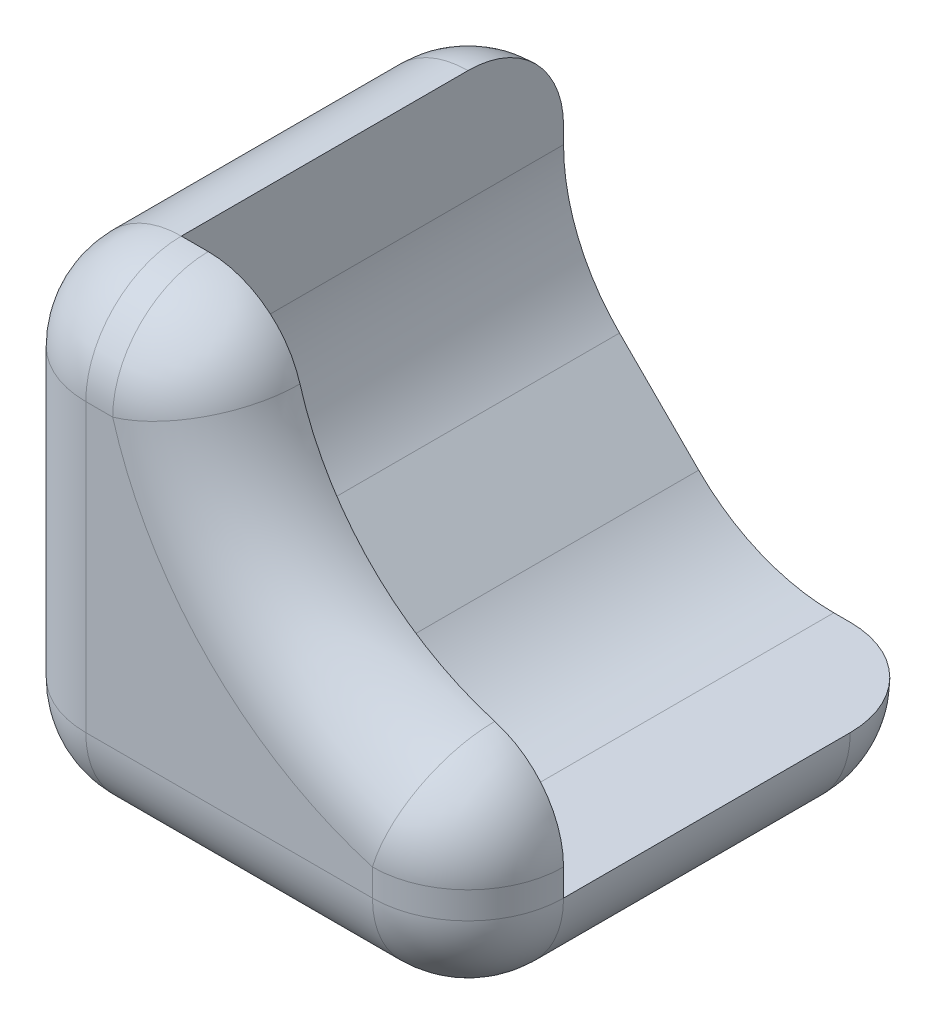
ISO-10303-21;
HEADER;
FILE_DESCRIPTION(('STEP AP214'),'2;1');
FILE_NAME('part.step','',(''),(''),'','','');
FILE_SCHEMA(('AUTOMOTIVE_DESIGN { 1 0 10303 214 1 1 1 1 }'));
ENDSEC;
DATA;
#1=APPLICATION_CONTEXT('core data for automotive mechanical design processes');
#2=APPLICATION_PROTOCOL_DEFINITION('international standard','automotive_design',2000,#1);
#3=PRODUCT_CONTEXT('',#1,'mechanical');
#4=PRODUCT('Part','Part','',(#3));
#5=PRODUCT_RELATED_PRODUCT_CATEGORY('part','',(#4));
#6=PRODUCT_DEFINITION_FORMATION('','',#4);
#7=PRODUCT_DEFINITION_CONTEXT('part definition',#1,'design');
#8=PRODUCT_DEFINITION('design','',#6,#7);
#9=PRODUCT_DEFINITION_SHAPE('','',#8);
#10=(LENGTH_UNIT() NAMED_UNIT(*) SI_UNIT(.MILLI.,.METRE.));
#11=(NAMED_UNIT(*) PLANE_ANGLE_UNIT() SI_UNIT($,.RADIAN.));
#12=(NAMED_UNIT(*) SI_UNIT($,.STERADIAN.) SOLID_ANGLE_UNIT());
#13=UNCERTAINTY_MEASURE_WITH_UNIT(LENGTH_MEASURE(1.E-05),#10,'distance_accuracy_value','');
#14=(GEOMETRIC_REPRESENTATION_CONTEXT(3) GLOBAL_UNCERTAINTY_ASSIGNED_CONTEXT((#13)) GLOBAL_UNIT_ASSIGNED_CONTEXT((#10,
#11,#12)) REPRESENTATION_CONTEXT('',''));
#15=CARTESIAN_POINT('',(0.,0.,0.));
#16=DIRECTION('',(0.,0.,1.));
#17=DIRECTION('',(1.,0.,0.));
#18=AXIS2_PLACEMENT_3D('',#15,#16,#17);
#19=CARTESIAN_POINT('',(0.,20.,-10.));
#20=DIRECTION('',(0.,0.,-1.));
#21=DIRECTION('',(-1.,0.,0.));
#22=AXIS2_PLACEMENT_3D('',#19,#20,#21);
#23=PLANE('',#22);
#24=CARTESIAN_POINT('',(7.07106781186547,15.,-10.));
#25=DIRECTION('',(0.,0.,-1.));
#26=DIRECTION('',(-1.,0.,0.));
#27=AXIS2_PLACEMENT_3D('',#24,#25,#26);
#28=CIRCLE('',#27,5.);
#29=CARTESIAN_POINT('',(7.0710678118655,10.,-10.));
#30=VERTEX_POINT('',#29);
#31=CARTESIAN_POINT('',(3.53553390593272,11.4644660940673,-10.));
#32=VERTEX_POINT('',#31);
#33=EDGE_CURVE('E172',#30,#32,#28,.T.);
#34=ORIENTED_EDGE('',*,*,#33,.F.);
#35=DIRECTION('',(1.,0.,0.));
#36=VECTOR('',#35,1.);
#37=CARTESIAN_POINT('',(0.,10.,-10.));
#38=LINE('',#37,#36);
#39=CARTESIAN_POINT('',(0.,10.,-10.));
#40=VERTEX_POINT('',#39);
#41=EDGE_CURVE('E236',#30,#40,#38,.F.);
#42=ORIENTED_EDGE('',*,*,#41,.T.);
#43=DIRECTION('',(0.,1.,0.));
#44=VECTOR('',#43,1.);
#45=CARTESIAN_POINT('',(0.,20.,-10.));
#46=LINE('',#45,#44);
#47=CARTESIAN_POINT('',(0.,17.0710678118655,-10.));
#48=VERTEX_POINT('',#47);
#49=EDGE_CURVE('E170',#40,#48,#46,.T.);
#50=ORIENTED_EDGE('',*,*,#49,.T.);
#51=CARTESIAN_POINT('',(5.,17.0710678118655,-10.));
#52=DIRECTION('',(0.,0.,-1.));
#53=DIRECTION('',(-1.,0.,0.));
#54=AXIS2_PLACEMENT_3D('',#51,#52,#53);
#55=CIRCLE('',#54,5.);
#56=CARTESIAN_POINT('',(1.46446609406728,13.5355339059327,-10.));
#57=VERTEX_POINT('',#56);
#58=EDGE_CURVE('E157',#57,#48,#55,.T.);
#59=ORIENTED_EDGE('',*,*,#58,.F.);
#60=DIRECTION('',(-0.707106781186548,0.707106781186547,0.));
#61=VECTOR('',#60,1.);
#62=CARTESIAN_POINT('',(7.5,7.5,-10.));
#63=LINE('',#62,#61);
#64=EDGE_CURVE('E168',#32,#57,#63,.T.);
#65=ORIENTED_EDGE('',*,*,#64,.F.);
#66=EDGE_LOOP('',(#34,#42,#50,#59,#65));
#67=FACE_BOUND('',#66,.T.);
#68=ADVANCED_FACE('F37',(#67),#23,.T.);
#69=CARTESIAN_POINT('',(0.,10.,0.));
#70=DIRECTION('',(0.,-1.,0.));
#71=DIRECTION('',(0.,0.,-1.));
#72=AXIS2_PLACEMENT_3D('',#69,#70,#71);
#73=PLANE('',#72);
#74=DIRECTION('',(0.,0.,-1.));
#75=VECTOR('',#74,1.);
#76=CARTESIAN_POINT('',(10.,10.,0.));
#77=LINE('',#76,#75);
#78=CARTESIAN_POINT('',(10.,10.,0.));
#79=VERTEX_POINT('',#78);
#80=CARTESIAN_POINT('',(10.,10.,-7.5));
#81=VERTEX_POINT('',#80);
#82=EDGE_CURVE('E202',#79,#81,#77,.T.);
#83=ORIENTED_EDGE('',*,*,#82,.T.);
#84=CARTESIAN_POINT('',(7.5,10.,-7.5));
#85=DIRECTION('',(0.,-1.,0.));
#86=DIRECTION('',(0.,0.,-1.));
#87=AXIS2_PLACEMENT_3D('',#84,#85,#86);
#88=CIRCLE('',#87,2.5);
#89=CARTESIAN_POINT('',(7.5,10.,-10.));
#90=VERTEX_POINT('',#89);
#91=EDGE_CURVE('E258',#81,#90,#88,.F.);
#92=ORIENTED_EDGE('',*,*,#91,.T.);
#93=DIRECTION('',(-1.,0.,0.));
#94=VECTOR('',#93,1.);
#95=CARTESIAN_POINT('',(0.,10.,-10.));
#96=LINE('',#95,#94);
#97=EDGE_CURVE('E206',#90,#30,#96,.T.);
#98=ORIENTED_EDGE('',*,*,#97,.T.);
#99=DIRECTION('',(0.,0.,1.));
#100=VECTOR('',#99,1.);
#101=CARTESIAN_POINT('',(7.0710678118655,10.,-10.));
#102=LINE('',#101,#100);
#103=CARTESIAN_POINT('',(7.0710678118655,10.,0.));
#104=VERTEX_POINT('',#103);
#105=EDGE_CURVE('E188',#30,#104,#102,.T.);
#106=ORIENTED_EDGE('',*,*,#105,.T.);
#107=DIRECTION('',(1.,0.,0.));
#108=VECTOR('',#107,1.);
#109=CARTESIAN_POINT('',(20.,10.,0.));
#110=LINE('',#109,#108);
#111=EDGE_CURVE('E191',#104,#79,#110,.T.);
#112=ORIENTED_EDGE('',*,*,#111,.T.);
#113=EDGE_LOOP('',(#83,#92,#98,#106,#112));
#114=FACE_BOUND('',#113,.T.);
#115=ADVANCED_FACE('F369',(#114),#73,.F.);
#116=CARTESIAN_POINT('',(0.,10.,-20.));
#117=DIRECTION('',(-1.,0.,0.));
#118=DIRECTION('',(0.,0.,1.));
#119=AXIS2_PLACEMENT_3D('',#116,#117,#118);
#120=PLANE('',#119);
#121=DIRECTION('',(0.,1.,0.));
#122=VECTOR('',#121,1.);
#123=CARTESIAN_POINT('',(0.,20.,-10.));
#124=LINE('',#123,#122);
#125=CARTESIAN_POINT('',(0.,17.5,-10.));
#126=VERTEX_POINT('',#125);
#127=EDGE_CURVE('E200',#48,#126,#124,.T.);
#128=ORIENTED_EDGE('',*,*,#127,.T.);
#129=CARTESIAN_POINT('',(0.,17.5,-7.5));
#130=DIRECTION('',(-1.,0.,0.));
#131=DIRECTION('',(0.,0.,1.));
#132=AXIS2_PLACEMENT_3D('',#129,#130,#131);
#133=CIRCLE('',#132,2.5);
#134=CARTESIAN_POINT('',(0.,20.,-7.5));
#135=VERTEX_POINT('',#134);
#136=EDGE_CURVE('E11',#126,#135,#133,.F.);
#137=ORIENTED_EDGE('',*,*,#136,.T.);
#138=DIRECTION('',(0.,0.,1.));
#139=VECTOR('',#138,1.);
#140=CARTESIAN_POINT('',(0.,20.,0.));
#141=LINE('',#140,#139);
#142=CARTESIAN_POINT('',(0.,20.,0.));
#143=VERTEX_POINT('',#142);
#144=EDGE_CURVE('E204',#135,#143,#141,.T.);
#145=ORIENTED_EDGE('',*,*,#144,.T.);
#146=DIRECTION('',(0.,1.,0.));
#147=VECTOR('',#146,1.);
#148=CARTESIAN_POINT('',(0.,10.,0.));
#149=LINE('',#148,#147);
#150=CARTESIAN_POINT('',(0.,17.0710678118655,0.));
#151=VERTEX_POINT('',#150);
#152=EDGE_CURVE('E194',#151,#143,#149,.T.);
#153=ORIENTED_EDGE('',*,*,#152,.F.);
#154=DIRECTION('',(0.,0.,1.));
#155=VECTOR('',#154,1.);
#156=CARTESIAN_POINT('',(0.,17.0710678118655,-10.));
#157=LINE('',#156,#155);
#158=EDGE_CURVE('E162',#48,#151,#157,.T.);
#159=ORIENTED_EDGE('',*,*,#158,.F.);
#160=EDGE_LOOP('',(#128,#137,#145,#153,#159));
#161=FACE_BOUND('',#160,.T.);
#162=ADVANCED_FACE('F306',(#161),#120,.F.);
#163=CARTESIAN_POINT('',(20.,10.,0.));
#164=DIRECTION('',(0.,0.,1.));
#165=DIRECTION('',(1.,0.,0.));
#166=AXIS2_PLACEMENT_3D('',#163,#164,#165);
#167=PLANE('',#166);
#168=DIRECTION('',(1.,0.,0.));
#169=VECTOR('',#168,1.);
#170=CARTESIAN_POINT('',(20.,20.,0.));
#171=LINE('',#170,#169);
#172=CARTESIAN_POINT('',(0.704264225231354,20.,0.));
#173=VERTEX_POINT('',#172);
#174=EDGE_CURVE('E190',#143,#173,#171,.T.);
#175=ORIENTED_EDGE('',*,*,#174,.T.);
#176=CARTESIAN_POINT('',(0.704264225231354,17.5,0.));
#177=DIRECTION('',(0.,0.,1.));
#178=DIRECTION('',(1.,0.,0.));
#179=AXIS2_PLACEMENT_3D('',#176,#177,#178);
#180=CIRCLE('',#179,2.5);
#181=CARTESIAN_POINT('',(3.10402338364829,18.2008252147248,0.));
#182=VERTEX_POINT('',#181);
#183=EDGE_CURVE('E266',#173,#182,#180,.F.);
#184=ORIENTED_EDGE('',*,*,#183,.T.);
#185=CARTESIAN_POINT('',(10.3033008588991,20.3033008588991,0.));
#186=DIRECTION('',(0.,0.,1.));
#187=DIRECTION('',(1.,0.,0.));
#188=AXIS2_PLACEMENT_3D('',#185,#186,#187);
#189=CIRCLE('',#188,7.5);
#190=CARTESIAN_POINT('',(8.20082521472478,13.1040233836483,0.));
#191=VERTEX_POINT('',#190);
#192=EDGE_CURVE('E183',#182,#191,#189,.T.);
#193=ORIENTED_EDGE('',*,*,#192,.T.);
#194=CARTESIAN_POINT('',(7.5,10.7042642252314,0.));
#195=DIRECTION('',(0.,0.,1.));
#196=DIRECTION('',(1.,0.,0.));
#197=AXIS2_PLACEMENT_3D('',#194,#195,#196);
#198=CIRCLE('',#197,2.5);
#199=CARTESIAN_POINT('',(10.,10.7042642252314,0.));
#200=VERTEX_POINT('',#199);
#201=EDGE_CURVE('E254',#191,#200,#198,.F.);
#202=ORIENTED_EDGE('',*,*,#201,.T.);
#203=DIRECTION('',(0.,-1.,0.));
#204=VECTOR('',#203,1.);
#205=CARTESIAN_POINT('',(10.,20.,0.));
#206=LINE('',#205,#204);
#207=EDGE_CURVE('E198',#200,#79,#206,.T.);
#208=ORIENTED_EDGE('',*,*,#207,.T.);
#209=ORIENTED_EDGE('',*,*,#111,.F.);
#210=CARTESIAN_POINT('',(7.07106781186547,15.,0.));
#211=DIRECTION('',(0.,0.,-1.));
#212=DIRECTION('',(-1.,0.,0.));
#213=AXIS2_PLACEMENT_3D('',#210,#211,#212);
#214=CIRCLE('',#213,5.);
#215=CARTESIAN_POINT('',(3.53553390593272,11.4644660940673,0.));
#216=VERTEX_POINT('',#215);
#217=EDGE_CURVE('E181',#104,#216,#214,.T.);
#218=ORIENTED_EDGE('',*,*,#217,.T.);
#219=DIRECTION('',(-0.707106781186548,0.707106781186547,0.));
#220=VECTOR('',#219,1.);
#221=CARTESIAN_POINT('',(7.5,7.5,0.));
#222=LINE('',#221,#220);
#223=CARTESIAN_POINT('',(1.46446609406728,13.5355339059327,0.));
#224=VERTEX_POINT('',#223);
#225=EDGE_CURVE('E185',#216,#224,#222,.T.);
#226=ORIENTED_EDGE('',*,*,#225,.T.);
#227=CARTESIAN_POINT('',(5.,17.0710678118655,0.));
#228=DIRECTION('',(0.,0.,-1.));
#229=DIRECTION('',(-1.,0.,0.));
#230=AXIS2_PLACEMENT_3D('',#227,#228,#229);
#231=CIRCLE('',#230,5.);
#232=EDGE_CURVE('E158',#224,#151,#231,.T.);
#233=ORIENTED_EDGE('',*,*,#232,.T.);
#234=ORIENTED_EDGE('',*,*,#152,.T.);
#235=EDGE_LOOP('',(#175,#184,#193,#202,#208,#209,#218,#226,#233,#234));
#236=FACE_BOUND('',#235,.T.);
#237=ADVANCED_FACE('F509',(#236),#167,.F.);
#238=CARTESIAN_POINT('',(7.07106781186547,15.,-10.));
#239=DIRECTION('',(0.,0.,1.));
#240=DIRECTION('',(1.,0.,0.));
#241=AXIS2_PLACEMENT_3D('',#238,#239,#240);
#242=CYLINDRICAL_SURFACE('',#241,5.);
#243=ORIENTED_EDGE('',*,*,#217,.F.);
#244=ORIENTED_EDGE('',*,*,#105,.F.);
#245=ORIENTED_EDGE('',*,*,#33,.T.);
#246=DIRECTION('',(0.,0.,1.));
#247=VECTOR('',#246,1.);
#248=CARTESIAN_POINT('',(3.53553390593272,11.4644660940673,-10.));
#249=LINE('',#248,#247);
#250=EDGE_CURVE('E163',#32,#216,#249,.T.);
#251=ORIENTED_EDGE('',*,*,#250,.T.);
#252=EDGE_LOOP('',(#243,#244,#245,#251));
#253=FACE_BOUND('',#252,.T.);
#254=ADVANCED_FACE('F516',(#253),#242,.F.);
#255=CARTESIAN_POINT('',(5.,17.0710678118655,-10.));
#256=DIRECTION('',(0.,0.,1.));
#257=DIRECTION('',(1.,0.,0.));
#258=AXIS2_PLACEMENT_3D('',#255,#256,#257);
#259=CYLINDRICAL_SURFACE('',#258,5.);
#260=ORIENTED_EDGE('',*,*,#232,.F.);
#261=DIRECTION('',(0.,0.,1.));
#262=VECTOR('',#261,1.);
#263=CARTESIAN_POINT('',(1.46446609406728,13.5355339059327,-10.));
#264=LINE('',#263,#262);
#265=EDGE_CURVE('E153',#57,#224,#264,.T.);
#266=ORIENTED_EDGE('',*,*,#265,.F.);
#267=ORIENTED_EDGE('',*,*,#58,.T.);
#268=ORIENTED_EDGE('',*,*,#158,.T.);
#269=EDGE_LOOP('',(#260,#266,#267,#268));
#270=FACE_BOUND('',#269,.T.);
#271=ADVANCED_FACE('F155',(#270),#259,.F.);
#272=CARTESIAN_POINT('',(7.5,7.5,-10.));
#273=DIRECTION('',(0.707106781186547,0.707106781186548,0.));
#274=DIRECTION('',(-0.707106781186548,0.707106781186547,0.));
#275=AXIS2_PLACEMENT_3D('',#272,#273,#274);
#276=PLANE('',#275);
#277=ORIENTED_EDGE('',*,*,#225,.F.);
#278=ORIENTED_EDGE('',*,*,#250,.F.);
#279=ORIENTED_EDGE('',*,*,#64,.T.);
#280=ORIENTED_EDGE('',*,*,#265,.T.);
#281=EDGE_LOOP('',(#277,#278,#279,#280));
#282=FACE_BOUND('',#281,.T.);
#283=ADVANCED_FACE('F174',(#282),#276,.T.);
#284=CARTESIAN_POINT('',(-2.5,0.,-19.));
#285=DIRECTION('',(-1.,0.,0.));
#286=DIRECTION('',(0.,-1.,0.));
#287=AXIS2_PLACEMENT_3D('',#284,#285,#286);
#288=PLANE('',#287);
#289=DIRECTION('',(0.,-1.,0.));
#290=VECTOR('',#289,1.);
#291=CARTESIAN_POINT('',(-2.49999999999999,20.,0.));
#292=LINE('',#291,#290);
#293=CARTESIAN_POINT('',(-2.5,10.,0.));
#294=VERTEX_POINT('',#293);
#295=CARTESIAN_POINT('',(-2.49999999999999,17.5,0.));
#296=VERTEX_POINT('',#295);
#297=EDGE_CURVE('E210',#294,#296,#292,.F.);
#298=ORIENTED_EDGE('',*,*,#297,.T.);
#299=DIRECTION('',(0.,0.,1.));
#300=VECTOR('',#299,1.);
#301=CARTESIAN_POINT('',(-2.49999999999999,17.5,-19.));
#302=LINE('',#301,#300);
#303=CARTESIAN_POINT('',(-2.49999999999999,17.5,-7.5));
#304=VERTEX_POINT('',#303);
#305=EDGE_CURVE('E61',#296,#304,#302,.F.);
#306=ORIENTED_EDGE('',*,*,#305,.T.);
#307=DIRECTION('',(0.,1.,0.));
#308=VECTOR('',#307,1.);
#309=CARTESIAN_POINT('',(-2.5,0.,-7.5));
#310=LINE('',#309,#308);
#311=CARTESIAN_POINT('',(-2.49999999999999,10.,-7.5));
#312=VERTEX_POINT('',#311);
#313=EDGE_CURVE('E238',#304,#312,#310,.F.);
#314=ORIENTED_EDGE('',*,*,#313,.T.);
#315=DIRECTION('',(0.,0.,1.));
#316=VECTOR('',#315,1.);
#317=CARTESIAN_POINT('',(-2.49999999999999,10.,0.));
#318=LINE('',#317,#316);
#319=EDGE_CURVE('E212',#312,#294,#318,.T.);
#320=ORIENTED_EDGE('',*,*,#319,.T.);
#321=EDGE_LOOP('',(#298,#306,#314,#320));
#322=FACE_BOUND('',#321,.T.);
#323=ADVANCED_FACE('F357',(#322),#288,.T.);
#324=CARTESIAN_POINT('',(0.,7.5,-19.));
#325=DIRECTION('',(0.,1.,0.));
#326=DIRECTION('',(0.,0.,1.));
#327=AXIS2_PLACEMENT_3D('',#324,#325,#326);
#328=PLANE('',#327);
#329=DIRECTION('',(1.,0.,0.));
#330=VECTOR('',#329,1.);
#331=CARTESIAN_POINT('',(10.,7.5,-7.5));
#332=LINE('',#331,#330);
#333=CARTESIAN_POINT('',(0.,7.5,-7.5));
#334=VERTEX_POINT('',#333);
#335=CARTESIAN_POINT('',(7.5,7.5,-7.5));
#336=VERTEX_POINT('',#335);
#337=EDGE_CURVE('E225',#334,#336,#332,.T.);
#338=ORIENTED_EDGE('',*,*,#337,.T.);
#339=DIRECTION('',(0.,0.,1.));
#340=VECTOR('',#339,1.);
#341=CARTESIAN_POINT('',(7.5,7.5,0.));
#342=LINE('',#341,#340);
#343=CARTESIAN_POINT('',(7.5,7.5,0.));
#344=VERTEX_POINT('',#343);
#345=EDGE_CURVE('E262',#336,#344,#342,.T.);
#346=ORIENTED_EDGE('',*,*,#345,.T.);
#347=DIRECTION('',(-1.,0.,0.));
#348=VECTOR('',#347,1.);
#349=CARTESIAN_POINT('',(0.,7.5,0.));
#350=LINE('',#349,#348);
#351=CARTESIAN_POINT('',(0.,7.5,0.));
#352=VERTEX_POINT('',#351);
#353=EDGE_CURVE('E214',#344,#352,#350,.T.);
#354=ORIENTED_EDGE('',*,*,#353,.T.);
#355=DIRECTION('',(0.,0.,1.));
#356=VECTOR('',#355,1.);
#357=CARTESIAN_POINT('',(0.,7.5,-10.));
#358=LINE('',#357,#356);
#359=EDGE_CURVE('E216',#352,#334,#358,.F.);
#360=ORIENTED_EDGE('',*,*,#359,.T.);
#361=EDGE_LOOP('',(#338,#346,#354,#360));
#362=FACE_BOUND('',#361,.T.);
#363=ADVANCED_FACE('F322',(#362),#328,.F.);
#364=CARTESIAN_POINT('',(-19.,21.705482913696,2.5));
#365=DIRECTION('',(0.,0.,-1.));
#366=DIRECTION('',(0.,1.,0.));
#367=AXIS2_PLACEMENT_3D('',#364,#365,#366);
#368=PLANE('',#367);
#369=CARTESIAN_POINT('',(10.3033008588991,20.3033008588991,2.5));
#370=DIRECTION('',(0.,0.,-1.));
#371=DIRECTION('',(0.,1.,0.));
#372=AXIS2_PLACEMENT_3D('',#369,#370,#371);
#373=CIRCLE('',#372,10.);
#374=CARTESIAN_POINT('',(7.5,10.7042642252314,2.5));
#375=VERTEX_POINT('',#374);
#376=CARTESIAN_POINT('',(0.704264225231354,17.5,2.5));
#377=VERTEX_POINT('',#376);
#378=EDGE_CURVE('E242',#375,#377,#373,.T.);
#379=ORIENTED_EDGE('',*,*,#378,.T.);
#380=DIRECTION('',(-1.,0.,0.));
#381=VECTOR('',#380,1.);
#382=CARTESIAN_POINT('',(0.,17.5,2.5));
#383=LINE('',#382,#381);
#384=CARTESIAN_POINT('',(0.,17.5,2.5));
#385=VERTEX_POINT('',#384);
#386=EDGE_CURVE('E282',#377,#385,#383,.T.);
#387=ORIENTED_EDGE('',*,*,#386,.T.);
#388=DIRECTION('',(0.,-1.,0.));
#389=VECTOR('',#388,1.);
#390=CARTESIAN_POINT('',(0.,7.5,2.5));
#391=LINE('',#390,#389);
#392=CARTESIAN_POINT('',(0.,10.,2.5));
#393=VERTEX_POINT('',#392);
#394=EDGE_CURVE('E208',#385,#393,#391,.T.);
#395=ORIENTED_EDGE('',*,*,#394,.T.);
#396=DIRECTION('',(-1.,0.,0.));
#397=VECTOR('',#396,1.);
#398=CARTESIAN_POINT('',(-19.,10.,2.5));
#399=LINE('',#398,#397);
#400=CARTESIAN_POINT('',(7.5,10.,2.5));
#401=VERTEX_POINT('',#400);
#402=EDGE_CURVE('E222',#393,#401,#399,.F.);
#403=ORIENTED_EDGE('',*,*,#402,.T.);
#404=DIRECTION('',(0.,1.,0.));
#405=VECTOR('',#404,1.);
#406=CARTESIAN_POINT('',(7.5,10.3079014877388,2.5));
#407=LINE('',#406,#405);
#408=EDGE_CURVE('E256',#401,#375,#407,.T.);
#409=ORIENTED_EDGE('',*,*,#408,.T.);
#410=EDGE_LOOP('',(#379,#387,#395,#403,#409));
#411=FACE_BOUND('',#410,.T.);
#412=ADVANCED_FACE('F343',(#411),#368,.F.);
#413=CARTESIAN_POINT('',(0.,21.705482913696,0.));
#414=DIRECTION('',(0.,1.,0.));
#415=DIRECTION('',(0.,0.,1.));
#416=AXIS2_PLACEMENT_3D('',#413,#414,#415);
#417=CYLINDRICAL_SURFACE('',#416,2.5);
#418=ORIENTED_EDGE('',*,*,#394,.F.);
#419=CARTESIAN_POINT('',(0.,17.5,0.));
#420=DIRECTION('',(0.,1.,0.));
#421=DIRECTION('',(0.,0.,1.));
#422=AXIS2_PLACEMENT_3D('',#419,#420,#421);
#423=CIRCLE('',#422,2.5);
#424=EDGE_CURVE('E284',#385,#296,#423,.F.);
#425=ORIENTED_EDGE('',*,*,#424,.T.);
#426=ORIENTED_EDGE('',*,*,#297,.F.);
#427=CARTESIAN_POINT('',(0.,10.,0.));
#428=DIRECTION('',(0.,1.,0.));
#429=DIRECTION('',(0.,0.,1.));
#430=AXIS2_PLACEMENT_3D('',#427,#428,#429);
#431=CIRCLE('',#430,2.5);
#432=EDGE_CURVE('E219',#294,#393,#431,.T.);
#433=ORIENTED_EDGE('',*,*,#432,.T.);
#434=EDGE_LOOP('',(#418,#425,#426,#433));
#435=FACE_BOUND('',#434,.T.);
#436=ADVANCED_FACE('F350',(#435),#417,.T.);
#437=CARTESIAN_POINT('',(0.,10.,0.));
#438=DIRECTION('',(-1.,0.,0.));
#439=DIRECTION('',(0.,0.,1.));
#440=AXIS2_PLACEMENT_3D('',#437,#438,#439);
#441=CYLINDRICAL_SURFACE('',#440,2.5);
#442=ORIENTED_EDGE('',*,*,#353,.F.);
#443=CARTESIAN_POINT('',(7.5,10.,0.));
#444=DIRECTION('',(-1.,0.,0.));
#445=DIRECTION('',(0.,0.,1.));
#446=AXIS2_PLACEMENT_3D('',#443,#444,#445);
#447=CIRCLE('',#446,2.5);
#448=EDGE_CURVE('E264',#344,#401,#447,.T.);
#449=ORIENTED_EDGE('',*,*,#448,.T.);
#450=ORIENTED_EDGE('',*,*,#402,.F.);
#451=CARTESIAN_POINT('',(0.,10.,0.));
#452=DIRECTION('',(-1.,0.,0.));
#453=DIRECTION('',(0.,0.,1.));
#454=AXIS2_PLACEMENT_3D('',#451,#452,#453);
#455=CIRCLE('',#454,2.5);
#456=EDGE_CURVE('E229',#352,#393,#455,.T.);
#457=ORIENTED_EDGE('',*,*,#456,.F.);
#458=EDGE_LOOP('',(#442,#449,#450,#457));
#459=FACE_BOUND('',#458,.T.);
#460=ADVANCED_FACE('F340',(#459),#441,.T.);
#461=CARTESIAN_POINT('',(0.,10.,0.));
#462=DIRECTION('',(0.,1.,0.));
#463=DIRECTION('',(0.,0.,1.));
#464=AXIS2_PLACEMENT_3D('',#461,#462,#463);
#465=SPHERICAL_SURFACE('',#464,2.5);
#466=ORIENTED_EDGE('',*,*,#456,.T.);
#467=ORIENTED_EDGE('',*,*,#432,.F.);
#468=CARTESIAN_POINT('',(0.,10.,0.));
#469=DIRECTION('',(0.,0.,-1.));
#470=DIRECTION('',(-1.,0.,0.));
#471=AXIS2_PLACEMENT_3D('',#468,#469,#470);
#472=CIRCLE('',#471,2.5);
#473=EDGE_CURVE('E226',#352,#294,#472,.T.);
#474=ORIENTED_EDGE('',*,*,#473,.F.);
#475=EDGE_LOOP('',(#466,#467,#474));
#476=FACE_BOUND('',#475,.T.);
#477=ADVANCED_FACE('F353',(#476),#465,.T.);
#478=CARTESIAN_POINT('',(0.,10.,-19.));
#479=DIRECTION('',(0.,0.,-1.));
#480=DIRECTION('',(-1.,0.,0.));
#481=AXIS2_PLACEMENT_3D('',#478,#479,#480);
#482=CYLINDRICAL_SURFACE('',#481,2.5);
#483=ORIENTED_EDGE('',*,*,#319,.F.);
#484=CARTESIAN_POINT('',(0.,10.,-7.5));
#485=DIRECTION('',(0.,0.,-1.));
#486=DIRECTION('',(-1.,0.,0.));
#487=AXIS2_PLACEMENT_3D('',#484,#485,#486);
#488=CIRCLE('',#487,2.5);
#489=EDGE_CURVE('E240',#312,#334,#488,.F.);
#490=ORIENTED_EDGE('',*,*,#489,.T.);
#491=ORIENTED_EDGE('',*,*,#359,.F.);
#492=ORIENTED_EDGE('',*,*,#473,.T.);
#493=EDGE_LOOP('',(#483,#490,#491,#492));
#494=FACE_BOUND('',#493,.T.);
#495=ADVANCED_FACE('F356',(#494),#482,.T.);
#496=CARTESIAN_POINT('',(0.,20.,-7.5));
#497=DIRECTION('',(0.,1.,0.));
#498=DIRECTION('',(-1.,0.,0.));
#499=AXIS2_PLACEMENT_3D('',#496,#497,#498);
#500=CYLINDRICAL_SURFACE('',#499,2.5);
#501=ORIENTED_EDGE('',*,*,#313,.F.);
#502=CARTESIAN_POINT('',(0.,17.5,-7.5));
#503=DIRECTION('',(0.,1.,0.));
#504=DIRECTION('',(-1.,0.,0.));
#505=AXIS2_PLACEMENT_3D('',#502,#503,#504);
#506=CIRCLE('',#505,2.5);
#507=EDGE_CURVE('E46',#304,#126,#506,.F.);
#508=ORIENTED_EDGE('',*,*,#507,.T.);
#509=ORIENTED_EDGE('',*,*,#127,.F.);
#510=ORIENTED_EDGE('',*,*,#49,.F.);
#511=CARTESIAN_POINT('',(0.,10.,-7.5));
#512=DIRECTION('',(0.,-1.,0.));
#513=DIRECTION('',(0.,0.,-1.));
#514=AXIS2_PLACEMENT_3D('',#511,#512,#513);
#515=CIRCLE('',#514,2.5);
#516=EDGE_CURVE('E230',#312,#40,#515,.T.);
#517=ORIENTED_EDGE('',*,*,#516,.F.);
#518=EDGE_LOOP('',(#501,#508,#509,#510,#517));
#519=FACE_BOUND('',#518,.T.);
#520=ADVANCED_FACE('F308',(#519),#500,.T.);
#521=CARTESIAN_POINT('',(0.,10.,-7.5));
#522=DIRECTION('',(0.,0.,-1.));
#523=DIRECTION('',(-1.,0.,0.));
#524=AXIS2_PLACEMENT_3D('',#521,#522,#523);
#525=SPHERICAL_SURFACE('',#524,2.5);
#526=ORIENTED_EDGE('',*,*,#489,.F.);
#527=ORIENTED_EDGE('',*,*,#516,.T.);
#528=CARTESIAN_POINT('',(0.,10.,-7.5));
#529=DIRECTION('',(1.,0.,0.));
#530=DIRECTION('',(0.,0.,-1.));
#531=AXIS2_PLACEMENT_3D('',#528,#529,#530);
#532=CIRCLE('',#531,2.5);
#533=EDGE_CURVE('E243',#334,#40,#532,.T.);
#534=ORIENTED_EDGE('',*,*,#533,.F.);
#535=EDGE_LOOP('',(#526,#527,#534));
#536=FACE_BOUND('',#535,.T.);
#537=ADVANCED_FACE('F313',(#536),#525,.T.);
#538=CARTESIAN_POINT('',(0.,10.,-7.5));
#539=DIRECTION('',(-1.,0.,0.));
#540=DIRECTION('',(0.,0.,1.));
#541=AXIS2_PLACEMENT_3D('',#538,#539,#540);
#542=CYLINDRICAL_SURFACE('',#541,2.5);
#543=ORIENTED_EDGE('',*,*,#97,.F.);
#544=CARTESIAN_POINT('',(7.5,10.,-7.5));
#545=DIRECTION('',(-1.,0.,0.));
#546=DIRECTION('',(0.,0.,1.));
#547=AXIS2_PLACEMENT_3D('',#544,#545,#546);
#548=CIRCLE('',#547,2.5);
#549=EDGE_CURVE('E260',#90,#336,#548,.T.);
#550=ORIENTED_EDGE('',*,*,#549,.T.);
#551=ORIENTED_EDGE('',*,*,#337,.F.);
#552=ORIENTED_EDGE('',*,*,#533,.T.);
#553=ORIENTED_EDGE('',*,*,#41,.F.);
#554=EDGE_LOOP('',(#543,#550,#551,#552,#553));
#555=FACE_BOUND('',#554,.T.);
#556=ADVANCED_FACE('F318',(#555),#542,.T.);
#557=CARTESIAN_POINT('',(10.3033008588991,20.3033008588991,0.));
#558=DIRECTION('',(0.,0.,-1.));
#559=DIRECTION('',(0.,1.,0.));
#560=AXIS2_PLACEMENT_3D('',#557,#558,#559);
#561=TOROIDAL_SURFACE('',#560,10.,2.5);
#562=ORIENTED_EDGE('',*,*,#192,.F.);
#563=CARTESIAN_POINT('',(0.704264225231354,17.5,0.));
#564=DIRECTION('',(-0.28033008588991,0.959903663366775,0.));
#565=DIRECTION('',(-0.959903663366775,-0.28033008588991,0.));
#566=AXIS2_PLACEMENT_3D('',#563,#564,#565);
#567=CIRCLE('',#566,2.5);
#568=EDGE_CURVE('E279',#182,#377,#567,.F.);
#569=ORIENTED_EDGE('',*,*,#568,.T.);
#570=ORIENTED_EDGE('',*,*,#378,.F.);
#571=CARTESIAN_POINT('',(7.5,10.7042642252314,0.));
#572=DIRECTION('',(-0.959903663366775,0.280330085889911,0.));
#573=DIRECTION('',(-0.280330085889911,-0.959903663366775,0.));
#574=AXIS2_PLACEMENT_3D('',#571,#572,#573);
#575=CIRCLE('',#574,2.5);
#576=EDGE_CURVE('E251',#375,#191,#575,.T.);
#577=ORIENTED_EDGE('',*,*,#576,.T.);
#578=EDGE_LOOP('',(#562,#569,#570,#577));
#579=FACE_BOUND('',#578,.T.);
#580=ADVANCED_FACE('F391',(#579),#561,.T.);
#581=CARTESIAN_POINT('',(7.5,10.,-7.5));
#582=DIRECTION('',(1.,0.,0.));
#583=DIRECTION('',(0.,0.,-1.));
#584=AXIS2_PLACEMENT_3D('',#581,#582,#583);
#585=SPHERICAL_SURFACE('',#584,2.5);
#586=ORIENTED_EDGE('',*,*,#549,.F.);
#587=ORIENTED_EDGE('',*,*,#91,.F.);
#588=CARTESIAN_POINT('',(7.5,10.,-7.5));
#589=DIRECTION('',(0.,0.,1.));
#590=DIRECTION('',(1.,0.,0.));
#591=AXIS2_PLACEMENT_3D('',#588,#589,#590);
#592=CIRCLE('',#591,2.5);
#593=EDGE_CURVE('E246',#336,#81,#592,.T.);
#594=ORIENTED_EDGE('',*,*,#593,.F.);
#595=EDGE_LOOP('',(#586,#587,#594));
#596=FACE_BOUND('',#595,.T.);
#597=ADVANCED_FACE('F328',(#596),#585,.T.);
#598=CARTESIAN_POINT('',(7.5,10.,-19.));
#599=DIRECTION('',(0.,0.,-1.));
#600=DIRECTION('',(-1.,0.,0.));
#601=AXIS2_PLACEMENT_3D('',#598,#599,#600);
#602=CYLINDRICAL_SURFACE('',#601,2.5);
#603=CARTESIAN_POINT('',(7.5,10.,0.));
#604=DIRECTION('',(0.,0.,1.));
#605=DIRECTION('',(1.,0.,0.));
#606=AXIS2_PLACEMENT_3D('',#603,#604,#605);
#607=CIRCLE('',#606,2.5);
#608=EDGE_CURVE('E273',#344,#79,#607,.T.);
#609=ORIENTED_EDGE('',*,*,#608,.F.);
#610=ORIENTED_EDGE('',*,*,#345,.F.);
#611=ORIENTED_EDGE('',*,*,#593,.T.);
#612=ORIENTED_EDGE('',*,*,#82,.F.);
#613=EDGE_LOOP('',(#609,#610,#611,#612));
#614=FACE_BOUND('',#613,.T.);
#615=ADVANCED_FACE('F332',(#614),#602,.T.);
#616=CARTESIAN_POINT('',(7.5,10.,0.));
#617=DIRECTION('',(1.,0.,0.));
#618=DIRECTION('',(0.,0.,-1.));
#619=AXIS2_PLACEMENT_3D('',#616,#617,#618);
#620=SPHERICAL_SURFACE('',#619,2.5);
#621=ORIENTED_EDGE('',*,*,#448,.F.);
#622=ORIENTED_EDGE('',*,*,#608,.T.);
#623=CARTESIAN_POINT('',(7.5,10.,0.));
#624=DIRECTION('',(0.,1.,0.));
#625=DIRECTION('',(0.,0.,1.));
#626=AXIS2_PLACEMENT_3D('',#623,#624,#625);
#627=CIRCLE('',#626,2.5);
#628=EDGE_CURVE('E270',#401,#79,#627,.T.);
#629=ORIENTED_EDGE('',*,*,#628,.F.);
#630=EDGE_LOOP('',(#621,#622,#629));
#631=FACE_BOUND('',#630,.T.);
#632=ADVANCED_FACE('F336',(#631),#620,.T.);
#633=CARTESIAN_POINT('',(7.5,21.705482913696,0.));
#634=DIRECTION('',(0.,-1.,0.));
#635=DIRECTION('',(0.,0.,-1.));
#636=AXIS2_PLACEMENT_3D('',#633,#634,#635);
#637=CYLINDRICAL_SURFACE('',#636,2.5);
#638=ORIENTED_EDGE('',*,*,#628,.T.);
#639=ORIENTED_EDGE('',*,*,#207,.F.);
#640=CARTESIAN_POINT('',(7.5,10.7042642252314,0.));
#641=DIRECTION('',(0.,1.,0.));
#642=DIRECTION('',(-1.,0.,0.));
#643=AXIS2_PLACEMENT_3D('',#640,#641,#642);
#644=CIRCLE('',#643,2.5);
#645=EDGE_CURVE('E267',#375,#200,#644,.T.);
#646=ORIENTED_EDGE('',*,*,#645,.F.);
#647=ORIENTED_EDGE('',*,*,#408,.F.);
#648=EDGE_LOOP('',(#638,#639,#646,#647));
#649=FACE_BOUND('',#648,.T.);
#650=ADVANCED_FACE('F402',(#649),#637,.T.);
#651=CARTESIAN_POINT('',(7.5,10.7042642252314,0.));
#652=DIRECTION('',(1.,0.,0.));
#653=DIRECTION('',(0.,0.,-1.));
#654=AXIS2_PLACEMENT_3D('',#651,#652,#653);
#655=SPHERICAL_SURFACE('',#654,2.5);
#656=ORIENTED_EDGE('',*,*,#201,.F.);
#657=ORIENTED_EDGE('',*,*,#576,.F.);
#658=ORIENTED_EDGE('',*,*,#645,.T.);
#659=EDGE_LOOP('',(#656,#657,#658));
#660=FACE_BOUND('',#659,.T.);
#661=ADVANCED_FACE('F399',(#660),#655,.T.);
#662=CARTESIAN_POINT('',(0.,17.5,-7.5));
#663=DIRECTION('',(0.,1.,0.));
#664=DIRECTION('',(0.,0.,1.));
#665=AXIS2_PLACEMENT_3D('',#662,#663,#664);
#666=SPHERICAL_SURFACE('',#665,2.5);
#667=ORIENTED_EDGE('',*,*,#136,.F.);
#668=ORIENTED_EDGE('',*,*,#507,.F.);
#669=CARTESIAN_POINT('',(0.,17.5,-7.5));
#670=DIRECTION('',(0.,0.,1.));
#671=DIRECTION('',(1.,0.,0.));
#672=AXIS2_PLACEMENT_3D('',#669,#670,#671);
#673=CIRCLE('',#672,2.5);
#674=EDGE_CURVE('E41',#135,#304,#673,.T.);
#675=ORIENTED_EDGE('',*,*,#674,.F.);
#676=EDGE_LOOP('',(#667,#668,#675));
#677=FACE_BOUND('',#676,.T.);
#678=ADVANCED_FACE('F39',(#677),#666,.T.);
#679=CARTESIAN_POINT('',(0.,17.5,0.));
#680=DIRECTION('',(0.,0.,1.));
#681=DIRECTION('',(1.,0.,0.));
#682=AXIS2_PLACEMENT_3D('',#679,#680,#681);
#683=CYLINDRICAL_SURFACE('',#682,2.5);
#684=ORIENTED_EDGE('',*,*,#674,.T.);
#685=ORIENTED_EDGE('',*,*,#305,.F.);
#686=CARTESIAN_POINT('',(0.,17.5,0.));
#687=DIRECTION('',(0.,0.,1.));
#688=DIRECTION('',(1.,0.,0.));
#689=AXIS2_PLACEMENT_3D('',#686,#687,#688);
#690=CIRCLE('',#689,2.5);
#691=EDGE_CURVE('E292',#143,#296,#690,.T.);
#692=ORIENTED_EDGE('',*,*,#691,.F.);
#693=ORIENTED_EDGE('',*,*,#144,.F.);
#694=EDGE_LOOP('',(#684,#685,#692,#693));
#695=FACE_BOUND('',#694,.T.);
#696=ADVANCED_FACE('F302',(#695),#683,.T.);
#697=CARTESIAN_POINT('',(0.,17.5,0.));
#698=DIRECTION('',(0.,1.,0.));
#699=DIRECTION('',(0.,0.,1.));
#700=AXIS2_PLACEMENT_3D('',#697,#698,#699);
#701=SPHERICAL_SURFACE('',#700,2.5);
#702=ORIENTED_EDGE('',*,*,#691,.T.);
#703=ORIENTED_EDGE('',*,*,#424,.F.);
#704=CARTESIAN_POINT('',(0.,17.5,0.));
#705=DIRECTION('',(1.,0.,0.));
#706=DIRECTION('',(0.,0.,-1.));
#707=AXIS2_PLACEMENT_3D('',#704,#705,#706);
#708=CIRCLE('',#707,2.5);
#709=EDGE_CURVE('E290',#143,#385,#708,.T.);
#710=ORIENTED_EDGE('',*,*,#709,.F.);
#711=EDGE_LOOP('',(#702,#703,#710));
#712=FACE_BOUND('',#711,.T.);
#713=ADVANCED_FACE('F420',(#712),#701,.T.);
#714=CARTESIAN_POINT('',(-19.,17.5,0.));
#715=DIRECTION('',(1.,0.,0.));
#716=DIRECTION('',(0.,0.,-1.));
#717=AXIS2_PLACEMENT_3D('',#714,#715,#716);
#718=CYLINDRICAL_SURFACE('',#717,2.5);
#719=ORIENTED_EDGE('',*,*,#709,.T.);
#720=ORIENTED_EDGE('',*,*,#386,.F.);
#721=CARTESIAN_POINT('',(0.704264225231354,17.5,0.));
#722=DIRECTION('',(1.,0.,0.));
#723=DIRECTION('',(0.,0.,-1.));
#724=AXIS2_PLACEMENT_3D('',#721,#722,#723);
#725=CIRCLE('',#724,2.5);
#726=EDGE_CURVE('E288',#173,#377,#725,.T.);
#727=ORIENTED_EDGE('',*,*,#726,.F.);
#728=ORIENTED_EDGE('',*,*,#174,.F.);
#729=EDGE_LOOP('',(#719,#720,#727,#728));
#730=FACE_BOUND('',#729,.T.);
#731=ADVANCED_FACE('F416',(#730),#718,.T.);
#732=CARTESIAN_POINT('',(0.704264225231354,17.5,0.));
#733=DIRECTION('',(0.,1.,0.));
#734=DIRECTION('',(0.,0.,1.));
#735=AXIS2_PLACEMENT_3D('',#732,#733,#734);
#736=SPHERICAL_SURFACE('',#735,2.5);
#737=ORIENTED_EDGE('',*,*,#726,.T.);
#738=ORIENTED_EDGE('',*,*,#568,.F.);
#739=ORIENTED_EDGE('',*,*,#183,.F.);
#740=EDGE_LOOP('',(#737,#738,#739));
#741=FACE_BOUND('',#740,.T.);
#742=ADVANCED_FACE('F413',(#741),#736,.T.);
#743=CLOSED_SHELL('',(#68,#115,#162,#237,#254,#271,#283,#323,#363,#412,#436,#460,#477,#495,#520,
#537,#556,#580,#597,#615,#632,#650,#661,#678,#696,#713,#731,#742));
#744=MANIFOLD_SOLID_BREP('B2',#743);
#745=ADVANCED_BREP_SHAPE_REPRESENTATION('',(#18,#744),#14);
#746=SHAPE_DEFINITION_REPRESENTATION(#9,#745);
ENDSEC;
END-ISO-10303-21;
